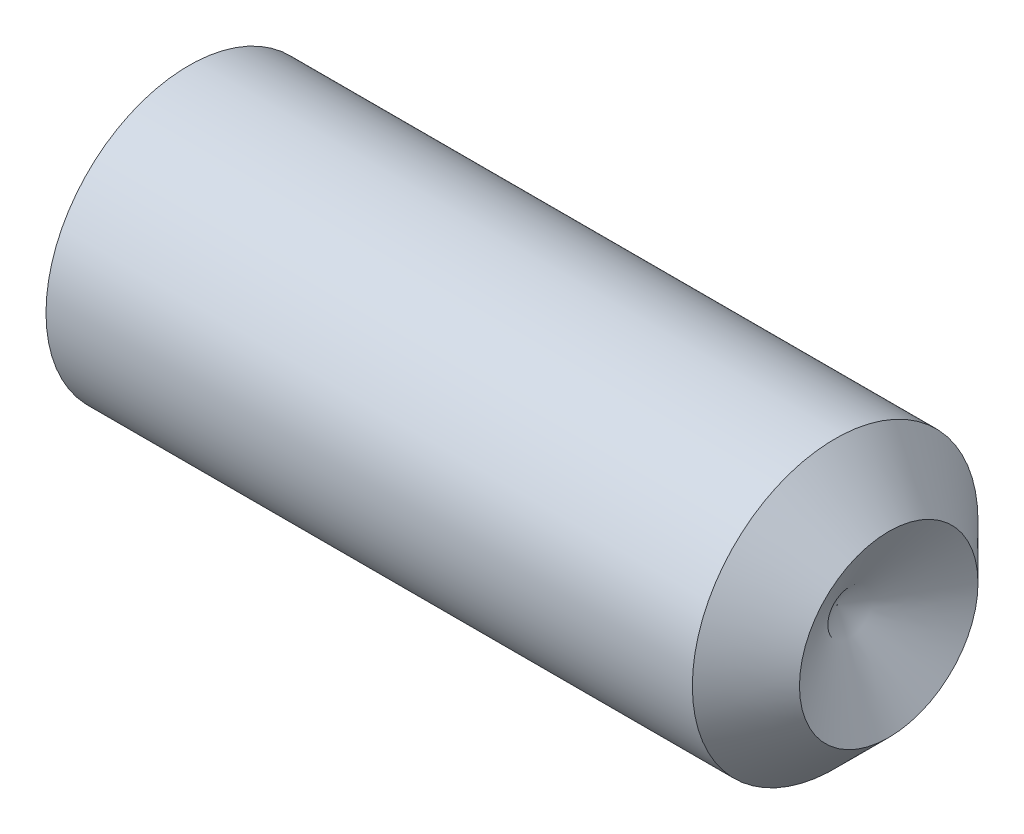
ISO-10303-21;
HEADER;
FILE_DESCRIPTION(('STEP AP214'),'2;1');
FILE_NAME('part.step','',(''),(''),'','','');
FILE_SCHEMA(('AUTOMOTIVE_DESIGN { 1 0 10303 214 1 1 1 1 }'));
ENDSEC;
DATA;
#1=APPLICATION_CONTEXT('core data for automotive mechanical design processes');
#2=APPLICATION_PROTOCOL_DEFINITION('international standard','automotive_design',2000,#1);
#3=PRODUCT_CONTEXT('',#1,'mechanical');
#4=PRODUCT('Part','Part','',(#3));
#5=PRODUCT_RELATED_PRODUCT_CATEGORY('part','',(#4));
#6=PRODUCT_DEFINITION_FORMATION('','',#4);
#7=PRODUCT_DEFINITION_CONTEXT('part definition',#1,'design');
#8=PRODUCT_DEFINITION('design','',#6,#7);
#9=PRODUCT_DEFINITION_SHAPE('','',#8);
#10=(LENGTH_UNIT() NAMED_UNIT(*) SI_UNIT(.MILLI.,.METRE.));
#11=(NAMED_UNIT(*) PLANE_ANGLE_UNIT() SI_UNIT($,.RADIAN.));
#12=(NAMED_UNIT(*) SI_UNIT($,.STERADIAN.) SOLID_ANGLE_UNIT());
#13=UNCERTAINTY_MEASURE_WITH_UNIT(LENGTH_MEASURE(1.E-05),#10,'distance_accuracy_value','');
#14=(GEOMETRIC_REPRESENTATION_CONTEXT(3) GLOBAL_UNCERTAINTY_ASSIGNED_CONTEXT((#13)) GLOBAL_UNIT_ASSIGNED_CONTEXT((#10,
#11,#12)) REPRESENTATION_CONTEXT('',''));
#15=CARTESIAN_POINT('',(0.,0.,0.));
#16=DIRECTION('',(0.,0.,1.));
#17=DIRECTION('',(1.,0.,0.));
#18=AXIS2_PLACEMENT_3D('',#15,#16,#17);
#19=CARTESIAN_POINT('',(0.,0.,0.));
#20=DIRECTION('',(1.,0.,0.));
#21=DIRECTION('',(0.,0.,-1.));
#22=AXIS2_PLACEMENT_3D('',#19,#20,#21);
#23=PLANE('',#22);
#24=DIRECTION('',(0.,0.866025403784438,-0.5));
#25=VECTOR('',#24,1.);
#26=CARTESIAN_POINT('',(0.,0.,2.3094010767585));
#27=LINE('',#26,#25);
#28=CARTESIAN_POINT('',(0.,0.,2.3094010767585));
#29=VERTEX_POINT('',#28);
#30=CARTESIAN_POINT('',(0.,2.,1.15470053837925));
#31=VERTEX_POINT('',#30);
#32=EDGE_CURVE('E123',#29,#31,#27,.T.);
#33=ORIENTED_EDGE('',*,*,#32,.F.);
#34=DIRECTION('',(0.,0.866025403784439,0.499999999999999));
#35=VECTOR('',#34,1.);
#36=CARTESIAN_POINT('',(0.,-2.,1.15470053837925));
#37=LINE('',#36,#35);
#38=CARTESIAN_POINT('',(0.,-2.,1.15470053837925));
#39=VERTEX_POINT('',#38);
#40=EDGE_CURVE('E50',#39,#29,#37,.T.);
#41=ORIENTED_EDGE('',*,*,#40,.F.);
#42=DIRECTION('',(0.,0.,1.));
#43=VECTOR('',#42,1.);
#44=CARTESIAN_POINT('',(0.,-2.,-1.15470053837925));
#45=LINE('',#44,#43);
#46=CARTESIAN_POINT('',(0.,-2.,-1.15470053837925));
#47=VERTEX_POINT('',#46);
#48=EDGE_CURVE('E109',#47,#39,#45,.T.);
#49=ORIENTED_EDGE('',*,*,#48,.F.);
#50=DIRECTION('',(0.,-0.866025403784438,0.5));
#51=VECTOR('',#50,1.);
#52=CARTESIAN_POINT('',(0.,0.,-2.3094010767585));
#53=LINE('',#52,#51);
#54=CARTESIAN_POINT('',(0.,0.,-2.3094010767585));
#55=VERTEX_POINT('',#54);
#56=EDGE_CURVE('E112',#55,#47,#53,.T.);
#57=ORIENTED_EDGE('',*,*,#56,.F.);
#58=DIRECTION('',(0.,-0.866025403784439,-0.499999999999999));
#59=VECTOR('',#58,1.);
#60=CARTESIAN_POINT('',(0.,2.,-1.15470053837925));
#61=LINE('',#60,#59);
#62=CARTESIAN_POINT('',(0.,2.,-1.15470053837925));
#63=VERTEX_POINT('',#62);
#64=EDGE_CURVE('E128',#63,#55,#61,.T.);
#65=ORIENTED_EDGE('',*,*,#64,.F.);
#66=DIRECTION('',(0.,0.,-1.));
#67=VECTOR('',#66,1.);
#68=CARTESIAN_POINT('',(0.,2.,1.15470053837925));
#69=LINE('',#68,#67);
#70=EDGE_CURVE('E125',#31,#63,#69,.T.);
#71=ORIENTED_EDGE('',*,*,#70,.F.);
#72=EDGE_LOOP('',(#33,#41,#49,#57,#65,#71));
#73=FACE_BOUND('',#72,.T.);
#74=CARTESIAN_POINT('',(0.,0.,0.));
#75=DIRECTION('',(-1.,0.,0.));
#76=DIRECTION('',(0.,0.,1.));
#77=AXIS2_PLACEMENT_3D('',#74,#75,#76);
#78=CIRCLE('',#77,3.3095);
#79=CARTESIAN_POINT('',(0.,0.,3.3095));
#80=VERTEX_POINT('',#79);
#81=EDGE_CURVE('E11',#80,#80,#78,.T.);
#82=ORIENTED_EDGE('',*,*,#81,.T.);
#83=EDGE_LOOP('',(#82));
#84=FACE_BOUND('',#83,.T.);
#85=ADVANCED_FACE('F36',(#73,#84),#23,.F.);
#86=CARTESIAN_POINT('',(0.398660360875434,0.,0.));
#87=DIRECTION('',(1.,0.,0.));
#88=DIRECTION('',(0.,0.,-1.));
#89=AXIS2_PLACEMENT_3D('',#86,#87,#88);
#90=CONICAL_SURFACE('',#89,4.,1.0471975511966);
#91=ORIENTED_EDGE('',*,*,#81,.F.);
#92=EDGE_LOOP('',(#91));
#93=FACE_BOUND('',#92,.T.);
#94=CARTESIAN_POINT('',(0.398660360875434,0.,0.));
#95=DIRECTION('',(-1.,0.,0.));
#96=DIRECTION('',(0.,0.,1.));
#97=AXIS2_PLACEMENT_3D('',#94,#95,#96);
#98=CIRCLE('',#97,4.);
#99=CARTESIAN_POINT('',(0.398660360875434,0.,4.));
#100=VERTEX_POINT('',#99);
#101=EDGE_CURVE('E43',#100,#100,#98,.T.);
#102=ORIENTED_EDGE('',*,*,#101,.T.);
#103=EDGE_LOOP('',(#102));
#104=FACE_BOUND('',#103,.T.);
#105=ADVANCED_FACE('F150',(#93,#104),#90,.T.);
#106=CARTESIAN_POINT('',(0.,0.,0.));
#107=DIRECTION('',(-1.,0.,0.));
#108=DIRECTION('',(0.,0.,1.));
#109=AXIS2_PLACEMENT_3D('',#106,#107,#108);
#110=CYLINDRICAL_SURFACE('',#109,4.);
#111=ORIENTED_EDGE('',*,*,#101,.F.);
#112=EDGE_LOOP('',(#111));
#113=FACE_BOUND('',#112,.T.);
#114=CARTESIAN_POINT('',(18.5,0.,0.));
#115=DIRECTION('',(-1.,0.,0.));
#116=DIRECTION('',(0.,0.,1.));
#117=AXIS2_PLACEMENT_3D('',#114,#115,#116);
#118=CIRCLE('',#117,4.);
#119=CARTESIAN_POINT('',(18.5,0.,4.));
#120=VERTEX_POINT('',#119);
#121=EDGE_CURVE('E145',#120,#120,#118,.T.);
#122=ORIENTED_EDGE('',*,*,#121,.T.);
#123=EDGE_LOOP('',(#122));
#124=FACE_BOUND('',#123,.T.);
#125=ADVANCED_FACE('F152',(#113,#124),#110,.T.);
#126=CARTESIAN_POINT('',(20.,0.,0.));
#127=DIRECTION('',(-1.,0.,0.));
#128=DIRECTION('',(0.,0.,1.));
#129=AXIS2_PLACEMENT_3D('',#126,#127,#128);
#130=CONICAL_SURFACE('',#129,2.5,0.785398163397449);
#131=ORIENTED_EDGE('',*,*,#121,.F.);
#132=EDGE_LOOP('',(#131));
#133=FACE_BOUND('',#132,.T.);
#134=CARTESIAN_POINT('',(20.,0.,0.));
#135=DIRECTION('',(-1.,0.,0.));
#136=DIRECTION('',(0.,0.,1.));
#137=AXIS2_PLACEMENT_3D('',#134,#135,#136);
#138=CIRCLE('',#137,2.5);
#139=CARTESIAN_POINT('',(20.,0.,2.5));
#140=VERTEX_POINT('',#139);
#141=EDGE_CURVE('E135',#140,#140,#138,.T.);
#142=ORIENTED_EDGE('',*,*,#141,.T.);
#143=EDGE_LOOP('',(#142));
#144=FACE_BOUND('',#143,.T.);
#145=ADVANCED_FACE('F155',(#133,#144),#130,.T.);
#146=CARTESIAN_POINT('',(18.5566243270259,0.,0.));
#147=DIRECTION('',(1.,0.,0.));
#148=DIRECTION('',(0.,0.,-1.));
#149=AXIS2_PLACEMENT_3D('',#146,#147,#148);
#150=CONICAL_SURFACE('',#149,0.,1.04719755119659);
#151=ORIENTED_EDGE('',*,*,#141,.F.);
#152=EDGE_LOOP('',(#151));
#153=FACE_BOUND('',#152,.T.);
#154=CARTESIAN_POINT('',(18.5566243270259,0.,0.));
#155=VERTEX_POINT('',#154);
#156=VERTEX_LOOP('',#155);
#157=FACE_BOUND('',#156,.T.);
#158=ADVANCED_FACE('F161',(#153,#157),#150,.F.);
#159=CARTESIAN_POINT('',(5.,-2.,1.15470053837925));
#160=DIRECTION('',(0.,-0.499999999999999,0.866025403784439));
#161=DIRECTION('',(0.,-0.866025403784439,-0.499999999999999));
#162=AXIS2_PLACEMENT_3D('',#159,#160,#161);
#163=PLANE('',#162);
#164=ORIENTED_EDGE('',*,*,#40,.T.);
#165=DIRECTION('',(-1.,0.,0.));
#166=VECTOR('',#165,1.);
#167=CARTESIAN_POINT('',(5.,0.,2.3094010767585));
#168=LINE('',#167,#166);
#169=CARTESIAN_POINT('',(5.,0.,2.3094010767585));
#170=VERTEX_POINT('',#169);
#171=EDGE_CURVE('E86',#170,#29,#168,.T.);
#172=ORIENTED_EDGE('',*,*,#171,.F.);
#173=DIRECTION('',(0.,0.866025403784439,0.499999999999999));
#174=VECTOR('',#173,1.);
#175=CARTESIAN_POINT('',(5.,-2.,1.15470053837925));
#176=LINE('',#175,#174);
#177=CARTESIAN_POINT('',(5.,-2.,1.15470053837925));
#178=VERTEX_POINT('',#177);
#179=EDGE_CURVE('E90',#178,#170,#176,.T.);
#180=ORIENTED_EDGE('',*,*,#179,.F.);
#181=DIRECTION('',(-1.,0.,0.));
#182=VECTOR('',#181,1.);
#183=CARTESIAN_POINT('',(5.,-2.,1.15470053837925));
#184=LINE('',#183,#182);
#185=EDGE_CURVE('E133',#178,#39,#184,.T.);
#186=ORIENTED_EDGE('',*,*,#185,.T.);
#187=EDGE_LOOP('',(#164,#172,#180,#186));
#188=FACE_BOUND('',#187,.T.);
#189=ADVANCED_FACE('F88',(#188),#163,.F.);
#190=CARTESIAN_POINT('',(5.,-2.,-1.15470053837925));
#191=DIRECTION('',(0.,-1.,0.));
#192=DIRECTION('',(0.,0.,-1.));
#193=AXIS2_PLACEMENT_3D('',#190,#191,#192);
#194=PLANE('',#193);
#195=ORIENTED_EDGE('',*,*,#48,.T.);
#196=ORIENTED_EDGE('',*,*,#185,.F.);
#197=DIRECTION('',(0.,0.,1.));
#198=VECTOR('',#197,1.);
#199=CARTESIAN_POINT('',(5.,-2.,-1.15470053837925));
#200=LINE('',#199,#198);
#201=CARTESIAN_POINT('',(5.,-2.,-1.15470053837925));
#202=VERTEX_POINT('',#201);
#203=EDGE_CURVE('E96',#202,#178,#200,.T.);
#204=ORIENTED_EDGE('',*,*,#203,.F.);
#205=DIRECTION('',(-1.,0.,0.));
#206=VECTOR('',#205,1.);
#207=CARTESIAN_POINT('',(5.,-2.,-1.15470053837925));
#208=LINE('',#207,#206);
#209=EDGE_CURVE('E136',#202,#47,#208,.T.);
#210=ORIENTED_EDGE('',*,*,#209,.T.);
#211=EDGE_LOOP('',(#195,#196,#204,#210));
#212=FACE_BOUND('',#211,.T.);
#213=ADVANCED_FACE('F170',(#212),#194,.F.);
#214=CARTESIAN_POINT('',(5.,0.,-2.3094010767585));
#215=DIRECTION('',(0.,-0.5,-0.866025403784439));
#216=DIRECTION('',(0.,0.866025403784439,-0.5));
#217=AXIS2_PLACEMENT_3D('',#214,#215,#216);
#218=PLANE('',#217);
#219=ORIENTED_EDGE('',*,*,#56,.T.);
#220=ORIENTED_EDGE('',*,*,#209,.F.);
#221=DIRECTION('',(0.,-0.866025403784438,0.5));
#222=VECTOR('',#221,1.);
#223=CARTESIAN_POINT('',(5.,0.,-2.3094010767585));
#224=LINE('',#223,#222);
#225=CARTESIAN_POINT('',(5.,0.,-2.3094010767585));
#226=VERTEX_POINT('',#225);
#227=EDGE_CURVE('E119',#226,#202,#224,.T.);
#228=ORIENTED_EDGE('',*,*,#227,.F.);
#229=DIRECTION('',(-1.,0.,0.));
#230=VECTOR('',#229,1.);
#231=CARTESIAN_POINT('',(5.,0.,-2.3094010767585));
#232=LINE('',#231,#230);
#233=EDGE_CURVE('E138',#226,#55,#232,.T.);
#234=ORIENTED_EDGE('',*,*,#233,.T.);
#235=EDGE_LOOP('',(#219,#220,#228,#234));
#236=FACE_BOUND('',#235,.T.);
#237=ADVANCED_FACE('F191',(#236),#218,.F.);
#238=CARTESIAN_POINT('',(5.,2.,-1.15470053837925));
#239=DIRECTION('',(0.,0.5,-0.866025403784439));
#240=DIRECTION('',(0.,0.866025403784439,0.5));
#241=AXIS2_PLACEMENT_3D('',#238,#239,#240);
#242=PLANE('',#241);
#243=ORIENTED_EDGE('',*,*,#64,.T.);
#244=ORIENTED_EDGE('',*,*,#233,.F.);
#245=DIRECTION('',(0.,-0.866025403784439,-0.499999999999999));
#246=VECTOR('',#245,1.);
#247=CARTESIAN_POINT('',(5.,2.,-1.15470053837925));
#248=LINE('',#247,#246);
#249=CARTESIAN_POINT('',(5.,2.,-1.15470053837925));
#250=VERTEX_POINT('',#249);
#251=EDGE_CURVE('E116',#250,#226,#248,.T.);
#252=ORIENTED_EDGE('',*,*,#251,.F.);
#253=DIRECTION('',(-1.,0.,0.));
#254=VECTOR('',#253,1.);
#255=CARTESIAN_POINT('',(5.,2.,-1.15470053837925));
#256=LINE('',#255,#254);
#257=EDGE_CURVE('E140',#250,#63,#256,.T.);
#258=ORIENTED_EDGE('',*,*,#257,.T.);
#259=EDGE_LOOP('',(#243,#244,#252,#258));
#260=FACE_BOUND('',#259,.T.);
#261=ADVANCED_FACE('F189',(#260),#242,.F.);
#262=CARTESIAN_POINT('',(5.,2.,1.15470053837925));
#263=DIRECTION('',(0.,1.,0.));
#264=DIRECTION('',(0.,0.,1.));
#265=AXIS2_PLACEMENT_3D('',#262,#263,#264);
#266=PLANE('',#265);
#267=ORIENTED_EDGE('',*,*,#70,.T.);
#268=ORIENTED_EDGE('',*,*,#257,.F.);
#269=DIRECTION('',(0.,0.,-1.));
#270=VECTOR('',#269,1.);
#271=CARTESIAN_POINT('',(5.,2.,1.15470053837925));
#272=LINE('',#271,#270);
#273=CARTESIAN_POINT('',(5.,2.,1.15470053837925));
#274=VERTEX_POINT('',#273);
#275=EDGE_CURVE('E104',#274,#250,#272,.T.);
#276=ORIENTED_EDGE('',*,*,#275,.F.);
#277=DIRECTION('',(-1.,0.,0.));
#278=VECTOR('',#277,1.);
#279=CARTESIAN_POINT('',(5.,2.,1.15470053837925));
#280=LINE('',#279,#278);
#281=EDGE_CURVE('E95',#274,#31,#280,.T.);
#282=ORIENTED_EDGE('',*,*,#281,.T.);
#283=EDGE_LOOP('',(#267,#268,#276,#282));
#284=FACE_BOUND('',#283,.T.);
#285=ADVANCED_FACE('F185',(#284),#266,.F.);
#286=CARTESIAN_POINT('',(5.,0.,2.3094010767585));
#287=DIRECTION('',(0.,0.5,0.866025403784438));
#288=DIRECTION('',(0.,-0.866025403784438,0.5));
#289=AXIS2_PLACEMENT_3D('',#286,#287,#288);
#290=PLANE('',#289);
#291=ORIENTED_EDGE('',*,*,#32,.T.);
#292=ORIENTED_EDGE('',*,*,#281,.F.);
#293=DIRECTION('',(0.,0.866025403784438,-0.5));
#294=VECTOR('',#293,1.);
#295=CARTESIAN_POINT('',(5.,0.,2.3094010767585));
#296=LINE('',#295,#294);
#297=EDGE_CURVE('E99',#170,#274,#296,.T.);
#298=ORIENTED_EDGE('',*,*,#297,.F.);
#299=ORIENTED_EDGE('',*,*,#171,.T.);
#300=EDGE_LOOP('',(#291,#292,#298,#299));
#301=FACE_BOUND('',#300,.T.);
#302=ADVANCED_FACE('F100',(#301),#290,.F.);
#303=CARTESIAN_POINT('',(5.,0.,2.3094010767585));
#304=DIRECTION('',(-1.,0.,0.));
#305=DIRECTION('',(0.,0.,1.));
#306=AXIS2_PLACEMENT_3D('',#303,#304,#305);
#307=PLANE('',#306);
#308=ORIENTED_EDGE('',*,*,#179,.T.);
#309=ORIENTED_EDGE('',*,*,#297,.T.);
#310=ORIENTED_EDGE('',*,*,#275,.T.);
#311=ORIENTED_EDGE('',*,*,#251,.T.);
#312=ORIENTED_EDGE('',*,*,#227,.T.);
#313=ORIENTED_EDGE('',*,*,#203,.T.);
#314=EDGE_LOOP('',(#308,#309,#310,#311,#312,#313));
#315=FACE_BOUND('',#314,.T.);
#316=ADVANCED_FACE('F106',(#315),#307,.T.);
#317=CLOSED_SHELL('',(#85,#105,#125,#145,#158,#189,#213,#237,#261,#285,#302,#316));
#318=MANIFOLD_SOLID_BREP('B2',#317);
#319=ADVANCED_BREP_SHAPE_REPRESENTATION('',(#18,#318),#14);
#320=SHAPE_DEFINITION_REPRESENTATION(#9,#319);
ENDSEC;
END-ISO-10303-21;
